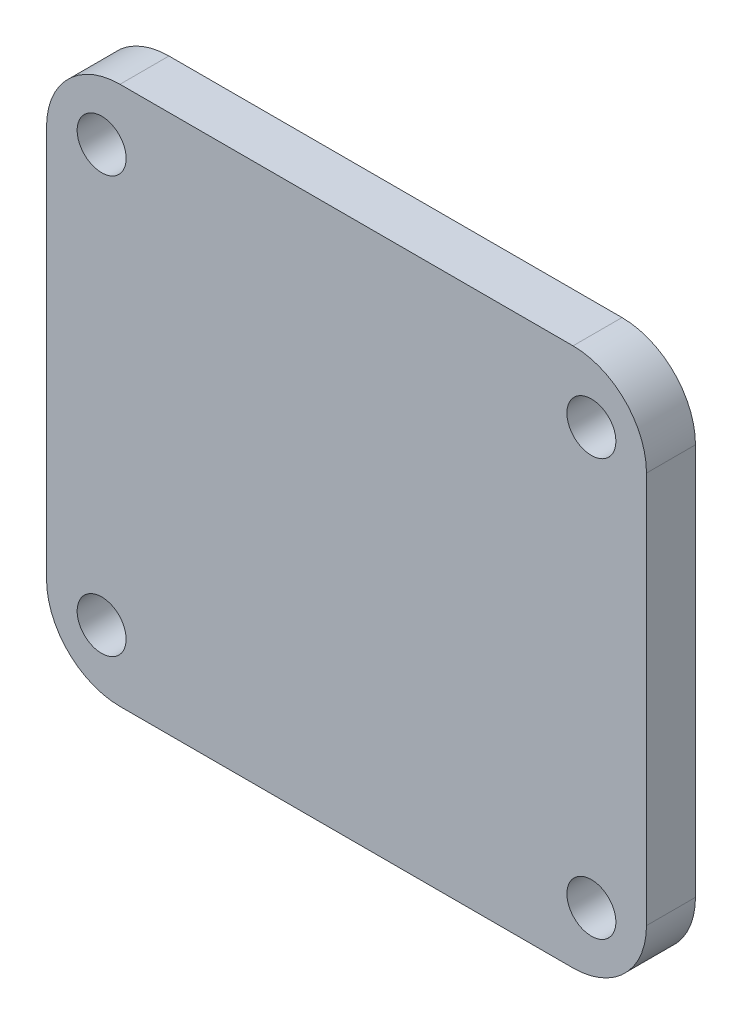
ISO-10303-21;
HEADER;
FILE_DESCRIPTION(('STEP AP214'),'2;1');
FILE_NAME('part.step','',(''),(''),'','','');
FILE_SCHEMA(('AUTOMOTIVE_DESIGN { 1 0 10303 214 1 1 1 1 }'));
ENDSEC;
DATA;
#1=APPLICATION_CONTEXT('core data for automotive mechanical design processes');
#2=APPLICATION_PROTOCOL_DEFINITION('international standard','automotive_design',2000,#1);
#3=PRODUCT_CONTEXT('',#1,'mechanical');
#4=PRODUCT('Part','Part','',(#3));
#5=PRODUCT_RELATED_PRODUCT_CATEGORY('part','',(#4));
#6=PRODUCT_DEFINITION_FORMATION('','',#4);
#7=PRODUCT_DEFINITION_CONTEXT('part definition',#1,'design');
#8=PRODUCT_DEFINITION('design','',#6,#7);
#9=PRODUCT_DEFINITION_SHAPE('','',#8);
#10=(LENGTH_UNIT() NAMED_UNIT(*) SI_UNIT(.MILLI.,.METRE.));
#11=(NAMED_UNIT(*) PLANE_ANGLE_UNIT() SI_UNIT($,.RADIAN.));
#12=(NAMED_UNIT(*) SI_UNIT($,.STERADIAN.) SOLID_ANGLE_UNIT());
#13=UNCERTAINTY_MEASURE_WITH_UNIT(LENGTH_MEASURE(1.E-05),#10,'distance_accuracy_value','');
#14=(GEOMETRIC_REPRESENTATION_CONTEXT(3) GLOBAL_UNCERTAINTY_ASSIGNED_CONTEXT((#13)) GLOBAL_UNIT_ASSIGNED_CONTEXT((#10,
#11,#12)) REPRESENTATION_CONTEXT('',''));
#15=CARTESIAN_POINT('',(0.,0.,0.));
#16=DIRECTION('',(0.,0.,1.));
#17=DIRECTION('',(1.,0.,0.));
#18=AXIS2_PLACEMENT_3D('',#15,#16,#17);
#19=CARTESIAN_POINT('',(0.,0.,2.));
#20=DIRECTION('',(0.,0.,-1.));
#21=DIRECTION('',(-1.,0.,0.));
#22=AXIS2_PLACEMENT_3D('',#19,#20,#21);
#23=PLANE('',#22);
#24=DIRECTION('',(1.,0.,0.));
#25=VECTOR('',#24,1.);
#26=CARTESIAN_POINT('',(-2.25,-2.50190000000003,2.));
#27=LINE('',#26,#25);
#28=CARTESIAN_POINT('',(0.749999999999998,-2.50190000000003,2.));
#29=VERTEX_POINT('',#28);
#30=CARTESIAN_POINT('',(19.25,-2.50190000000003,2.));
#31=VERTEX_POINT('',#30);
#32=EDGE_CURVE('E138',#29,#31,#27,.T.);
#33=ORIENTED_EDGE('',*,*,#32,.T.);
#34=CARTESIAN_POINT('',(19.25,0.498099999999968,2.));
#35=DIRECTION('',(0.,0.,-1.));
#36=DIRECTION('',(-1.,0.,0.));
#37=AXIS2_PLACEMENT_3D('',#34,#35,#36);
#38=CIRCLE('',#37,3.);
#39=CARTESIAN_POINT('',(22.25,0.498099999999967,2.));
#40=VERTEX_POINT('',#39);
#41=EDGE_CURVE('E156',#31,#40,#38,.F.);
#42=ORIENTED_EDGE('',*,*,#41,.T.);
#43=DIRECTION('',(0.,1.,0.));
#44=VECTOR('',#43,1.);
#45=CARTESIAN_POINT('',(22.25,-2.50190000000003,2.));
#46=LINE('',#45,#44);
#47=CARTESIAN_POINT('',(22.25,16.5019,2.));
#48=VERTEX_POINT('',#47);
#49=EDGE_CURVE('E120',#40,#48,#46,.T.);
#50=ORIENTED_EDGE('',*,*,#49,.T.);
#51=CARTESIAN_POINT('',(19.25,16.5019,2.));
#52=DIRECTION('',(0.,0.,-1.));
#53=DIRECTION('',(-1.,0.,0.));
#54=AXIS2_PLACEMENT_3D('',#51,#52,#53);
#55=CIRCLE('',#54,3.);
#56=CARTESIAN_POINT('',(19.25,19.5019,2.));
#57=VERTEX_POINT('',#56);
#58=EDGE_CURVE('E152',#48,#57,#55,.F.);
#59=ORIENTED_EDGE('',*,*,#58,.T.);
#60=DIRECTION('',(-1.,0.,0.));
#61=VECTOR('',#60,1.);
#62=CARTESIAN_POINT('',(-2.25,19.5019,2.));
#63=LINE('',#62,#61);
#64=CARTESIAN_POINT('',(0.749999999999998,19.5019,2.));
#65=VERTEX_POINT('',#64);
#66=EDGE_CURVE('E165',#57,#65,#63,.T.);
#67=ORIENTED_EDGE('',*,*,#66,.T.);
#68=CARTESIAN_POINT('',(0.749999999999998,16.5019,2.));
#69=DIRECTION('',(0.,0.,-1.));
#70=DIRECTION('',(-1.,0.,0.));
#71=AXIS2_PLACEMENT_3D('',#68,#69,#70);
#72=CIRCLE('',#71,3.);
#73=CARTESIAN_POINT('',(-2.25,16.5019,2.));
#74=VERTEX_POINT('',#73);
#75=EDGE_CURVE('E55',#65,#74,#72,.F.);
#76=ORIENTED_EDGE('',*,*,#75,.T.);
#77=DIRECTION('',(0.,-1.,0.));
#78=VECTOR('',#77,1.);
#79=CARTESIAN_POINT('',(-2.25,-2.50190000000003,2.));
#80=LINE('',#79,#78);
#81=CARTESIAN_POINT('',(-2.25,0.498099999999967,2.));
#82=VERTEX_POINT('',#81);
#83=EDGE_CURVE('E171',#74,#82,#80,.T.);
#84=ORIENTED_EDGE('',*,*,#83,.T.);
#85=CARTESIAN_POINT('',(0.749999999999998,0.498099999999968,2.));
#86=DIRECTION('',(0.,0.,-1.));
#87=DIRECTION('',(-1.,0.,0.));
#88=AXIS2_PLACEMENT_3D('',#85,#86,#87);
#89=CIRCLE('',#88,3.);
#90=EDGE_CURVE('E154',#82,#29,#89,.F.);
#91=ORIENTED_EDGE('',*,*,#90,.T.);
#92=EDGE_LOOP('',(#33,#42,#50,#59,#67,#76,#84,#91));
#93=FACE_BOUND('',#92,.T.);
#94=CARTESIAN_POINT('',(0.,0.,2.));
#95=DIRECTION('',(0.,0.,1.));
#96=DIRECTION('',(1.,0.,0.));
#97=AXIS2_PLACEMENT_3D('',#94,#95,#96);
#98=CIRCLE('',#97,1.);
#99=CARTESIAN_POINT('',(1.,0.,2.));
#100=VERTEX_POINT('',#99);
#101=EDGE_CURVE('E129',#100,#100,#98,.T.);
#102=ORIENTED_EDGE('',*,*,#101,.F.);
#103=EDGE_LOOP('',(#102));
#104=FACE_BOUND('',#103,.T.);
#105=CARTESIAN_POINT('',(20.,0.,2.));
#106=DIRECTION('',(0.,0.,1.));
#107=DIRECTION('',(1.,0.,0.));
#108=AXIS2_PLACEMENT_3D('',#105,#106,#107);
#109=CIRCLE('',#108,1.);
#110=CARTESIAN_POINT('',(21.,0.,2.));
#111=VERTEX_POINT('',#110);
#112=EDGE_CURVE('E186',#111,#111,#109,.T.);
#113=ORIENTED_EDGE('',*,*,#112,.F.);
#114=EDGE_LOOP('',(#113));
#115=FACE_BOUND('',#114,.T.);
#116=CARTESIAN_POINT('',(20.,17.,2.));
#117=DIRECTION('',(0.,0.,1.));
#118=DIRECTION('',(1.,0.,0.));
#119=AXIS2_PLACEMENT_3D('',#116,#117,#118);
#120=CIRCLE('',#119,1.);
#121=CARTESIAN_POINT('',(21.,17.,2.));
#122=VERTEX_POINT('',#121);
#123=EDGE_CURVE('E191',#122,#122,#120,.T.);
#124=ORIENTED_EDGE('',*,*,#123,.F.);
#125=EDGE_LOOP('',(#124));
#126=FACE_BOUND('',#125,.T.);
#127=CARTESIAN_POINT('',(0.,17.,2.));
#128=DIRECTION('',(0.,0.,1.));
#129=DIRECTION('',(1.,0.,0.));
#130=AXIS2_PLACEMENT_3D('',#127,#128,#129);
#131=CIRCLE('',#130,1.);
#132=CARTESIAN_POINT('',(1.,17.,2.));
#133=VERTEX_POINT('',#132);
#134=EDGE_CURVE('E197',#133,#133,#131,.T.);
#135=ORIENTED_EDGE('',*,*,#134,.F.);
#136=EDGE_LOOP('',(#135));
#137=FACE_BOUND('',#136,.T.);
#138=ADVANCED_FACE('F33',(#93,#104,#115,#126,#137),#23,.F.);
#139=CARTESIAN_POINT('',(0.,0.,0.));
#140=DIRECTION('',(0.,0.,-1.));
#141=DIRECTION('',(-1.,0.,0.));
#142=AXIS2_PLACEMENT_3D('',#139,#140,#141);
#143=PLANE('',#142);
#144=CARTESIAN_POINT('',(20.,17.,0.));
#145=DIRECTION('',(0.,0.,1.));
#146=DIRECTION('',(1.,0.,0.));
#147=AXIS2_PLACEMENT_3D('',#144,#145,#146);
#148=CIRCLE('',#147,1.);
#149=CARTESIAN_POINT('',(21.,17.,0.));
#150=VERTEX_POINT('',#149);
#151=EDGE_CURVE('E194',#150,#150,#148,.T.);
#152=ORIENTED_EDGE('',*,*,#151,.T.);
#153=EDGE_LOOP('',(#152));
#154=FACE_BOUND('',#153,.T.);
#155=CARTESIAN_POINT('',(0.,0.,0.));
#156=DIRECTION('',(0.,0.,1.));
#157=DIRECTION('',(1.,0.,0.));
#158=AXIS2_PLACEMENT_3D('',#155,#156,#157);
#159=CIRCLE('',#158,1.);
#160=CARTESIAN_POINT('',(1.,0.,0.));
#161=VERTEX_POINT('',#160);
#162=EDGE_CURVE('E135',#161,#161,#159,.T.);
#163=ORIENTED_EDGE('',*,*,#162,.T.);
#164=EDGE_LOOP('',(#163));
#165=FACE_BOUND('',#164,.T.);
#166=DIRECTION('',(0.,1.,0.));
#167=VECTOR('',#166,1.);
#168=CARTESIAN_POINT('',(22.25,-2.50190000000003,0.));
#169=LINE('',#168,#167);
#170=CARTESIAN_POINT('',(22.25,0.498099999999967,0.));
#171=VERTEX_POINT('',#170);
#172=CARTESIAN_POINT('',(22.25,16.5019,0.));
#173=VERTEX_POINT('',#172);
#174=EDGE_CURVE('E117',#171,#173,#169,.T.);
#175=ORIENTED_EDGE('',*,*,#174,.F.);
#176=CARTESIAN_POINT('',(19.25,0.498099999999968,0.));
#177=DIRECTION('',(0.,0.,-1.));
#178=DIRECTION('',(-1.,0.,0.));
#179=AXIS2_PLACEMENT_3D('',#176,#177,#178);
#180=CIRCLE('',#179,3.);
#181=CARTESIAN_POINT('',(19.25,-2.50190000000003,0.));
#182=VERTEX_POINT('',#181);
#183=EDGE_CURVE('E100',#171,#182,#180,.T.);
#184=ORIENTED_EDGE('',*,*,#183,.T.);
#185=DIRECTION('',(1.,0.,0.));
#186=VECTOR('',#185,1.);
#187=CARTESIAN_POINT('',(-2.25,-2.50190000000003,0.));
#188=LINE('',#187,#186);
#189=CARTESIAN_POINT('',(0.749999999999998,-2.50190000000003,0.));
#190=VERTEX_POINT('',#189);
#191=EDGE_CURVE('E142',#190,#182,#188,.T.);
#192=ORIENTED_EDGE('',*,*,#191,.F.);
#193=CARTESIAN_POINT('',(0.749999999999998,0.498099999999968,0.));
#194=DIRECTION('',(0.,0.,-1.));
#195=DIRECTION('',(-1.,0.,0.));
#196=AXIS2_PLACEMENT_3D('',#193,#194,#195);
#197=CIRCLE('',#196,3.);
#198=CARTESIAN_POINT('',(-2.25,0.498099999999967,0.));
#199=VERTEX_POINT('',#198);
#200=EDGE_CURVE('E111',#190,#199,#197,.T.);
#201=ORIENTED_EDGE('',*,*,#200,.T.);
#202=DIRECTION('',(0.,-1.,0.));
#203=VECTOR('',#202,1.);
#204=CARTESIAN_POINT('',(-2.25,-2.50190000000003,0.));
#205=LINE('',#204,#203);
#206=CARTESIAN_POINT('',(-2.25,16.5019,0.));
#207=VERTEX_POINT('',#206);
#208=EDGE_CURVE('E132',#207,#199,#205,.T.);
#209=ORIENTED_EDGE('',*,*,#208,.F.);
#210=CARTESIAN_POINT('',(0.749999999999998,16.5019,0.));
#211=DIRECTION('',(0.,0.,-1.));
#212=DIRECTION('',(-1.,0.,0.));
#213=AXIS2_PLACEMENT_3D('',#210,#211,#212);
#214=CIRCLE('',#213,3.);
#215=CARTESIAN_POINT('',(0.749999999999998,19.5019,0.));
#216=VERTEX_POINT('',#215);
#217=EDGE_CURVE('E121',#207,#216,#214,.T.);
#218=ORIENTED_EDGE('',*,*,#217,.T.);
#219=DIRECTION('',(-1.,0.,0.));
#220=VECTOR('',#219,1.);
#221=CARTESIAN_POINT('',(-2.25,19.5019,0.));
#222=LINE('',#221,#220);
#223=CARTESIAN_POINT('',(19.25,19.5019,0.));
#224=VERTEX_POINT('',#223);
#225=EDGE_CURVE('E128',#224,#216,#222,.T.);
#226=ORIENTED_EDGE('',*,*,#225,.F.);
#227=CARTESIAN_POINT('',(19.25,16.5019,0.));
#228=DIRECTION('',(0.,0.,-1.));
#229=DIRECTION('',(-1.,0.,0.));
#230=AXIS2_PLACEMENT_3D('',#227,#228,#229);
#231=CIRCLE('',#230,3.);
#232=EDGE_CURVE('E127',#224,#173,#231,.T.);
#233=ORIENTED_EDGE('',*,*,#232,.T.);
#234=EDGE_LOOP('',(#175,#184,#192,#201,#209,#218,#226,#233));
#235=FACE_BOUND('',#234,.T.);
#236=CARTESIAN_POINT('',(20.,0.,0.));
#237=DIRECTION('',(0.,0.,1.));
#238=DIRECTION('',(1.,0.,0.));
#239=AXIS2_PLACEMENT_3D('',#236,#237,#238);
#240=CIRCLE('',#239,1.);
#241=CARTESIAN_POINT('',(21.,0.,0.));
#242=VERTEX_POINT('',#241);
#243=EDGE_CURVE('E188',#242,#242,#240,.T.);
#244=ORIENTED_EDGE('',*,*,#243,.T.);
#245=EDGE_LOOP('',(#244));
#246=FACE_BOUND('',#245,.T.);
#247=CARTESIAN_POINT('',(0.,17.,0.));
#248=DIRECTION('',(0.,0.,1.));
#249=DIRECTION('',(1.,0.,0.));
#250=AXIS2_PLACEMENT_3D('',#247,#248,#249);
#251=CIRCLE('',#250,1.);
#252=CARTESIAN_POINT('',(1.,17.,0.));
#253=VERTEX_POINT('',#252);
#254=EDGE_CURVE('E200',#253,#253,#251,.T.);
#255=ORIENTED_EDGE('',*,*,#254,.T.);
#256=EDGE_LOOP('',(#255));
#257=FACE_BOUND('',#256,.T.);
#258=ADVANCED_FACE('F124',(#154,#165,#235,#246,#257),#143,.T.);
#259=CARTESIAN_POINT('',(22.25,-2.50190000000003,2.));
#260=DIRECTION('',(-1.,0.,0.));
#261=DIRECTION('',(0.,0.,1.));
#262=AXIS2_PLACEMENT_3D('',#259,#260,#261);
#263=PLANE('',#262);
#264=ORIENTED_EDGE('',*,*,#49,.F.);
#265=DIRECTION('',(0.,0.,-1.));
#266=VECTOR('',#265,1.);
#267=CARTESIAN_POINT('',(22.25,0.498099999999968,2.));
#268=LINE('',#267,#266);
#269=EDGE_CURVE('E104',#40,#171,#268,.T.);
#270=ORIENTED_EDGE('',*,*,#269,.T.);
#271=ORIENTED_EDGE('',*,*,#174,.T.);
#272=DIRECTION('',(0.,0.,-1.));
#273=VECTOR('',#272,1.);
#274=CARTESIAN_POINT('',(22.25,16.5019,2.));
#275=LINE('',#274,#273);
#276=EDGE_CURVE('E122',#173,#48,#275,.F.);
#277=ORIENTED_EDGE('',*,*,#276,.T.);
#278=EDGE_LOOP('',(#264,#270,#271,#277));
#279=FACE_BOUND('',#278,.T.);
#280=ADVANCED_FACE('F116',(#279),#263,.F.);
#281=CARTESIAN_POINT('',(-2.25,19.5019,2.));
#282=DIRECTION('',(0.,-1.,0.));
#283=DIRECTION('',(0.,0.,-1.));
#284=AXIS2_PLACEMENT_3D('',#281,#282,#283);
#285=PLANE('',#284);
#286=ORIENTED_EDGE('',*,*,#66,.F.);
#287=DIRECTION('',(0.,0.,-1.));
#288=VECTOR('',#287,1.);
#289=CARTESIAN_POINT('',(19.25,19.5019,2.));
#290=LINE('',#289,#288);
#291=EDGE_CURVE('E11',#57,#224,#290,.T.);
#292=ORIENTED_EDGE('',*,*,#291,.T.);
#293=ORIENTED_EDGE('',*,*,#225,.T.);
#294=DIRECTION('',(0.,0.,-1.));
#295=VECTOR('',#294,1.);
#296=CARTESIAN_POINT('',(0.749999999999998,19.5019,2.));
#297=LINE('',#296,#295);
#298=EDGE_CURVE('E41',#216,#65,#297,.F.);
#299=ORIENTED_EDGE('',*,*,#298,.T.);
#300=EDGE_LOOP('',(#286,#292,#293,#299));
#301=FACE_BOUND('',#300,.T.);
#302=ADVANCED_FACE('F164',(#301),#285,.F.);
#303=CARTESIAN_POINT('',(-2.25,-2.50190000000003,2.));
#304=DIRECTION('',(1.,0.,0.));
#305=DIRECTION('',(0.,0.,-1.));
#306=AXIS2_PLACEMENT_3D('',#303,#304,#305);
#307=PLANE('',#306);
#308=ORIENTED_EDGE('',*,*,#208,.T.);
#309=DIRECTION('',(0.,0.,-1.));
#310=VECTOR('',#309,1.);
#311=CARTESIAN_POINT('',(-2.25,0.498099999999968,2.));
#312=LINE('',#311,#310);
#313=EDGE_CURVE('E48',#199,#82,#312,.F.);
#314=ORIENTED_EDGE('',*,*,#313,.T.);
#315=ORIENTED_EDGE('',*,*,#83,.F.);
#316=DIRECTION('',(0.,0.,-1.));
#317=VECTOR('',#316,1.);
#318=CARTESIAN_POINT('',(-2.25,16.5019,2.));
#319=LINE('',#318,#317);
#320=EDGE_CURVE('E158',#74,#207,#319,.T.);
#321=ORIENTED_EDGE('',*,*,#320,.T.);
#322=EDGE_LOOP('',(#308,#314,#315,#321));
#323=FACE_BOUND('',#322,.T.);
#324=ADVANCED_FACE('F175',(#323),#307,.F.);
#325=CARTESIAN_POINT('',(-2.25,-2.50190000000003,2.));
#326=DIRECTION('',(0.,1.,0.));
#327=DIRECTION('',(0.,0.,1.));
#328=AXIS2_PLACEMENT_3D('',#325,#326,#327);
#329=PLANE('',#328);
#330=ORIENTED_EDGE('',*,*,#191,.T.);
#331=DIRECTION('',(0.,0.,-1.));
#332=VECTOR('',#331,1.);
#333=CARTESIAN_POINT('',(19.25,-2.50190000000003,2.));
#334=LINE('',#333,#332);
#335=EDGE_CURVE('E105',#182,#31,#334,.F.);
#336=ORIENTED_EDGE('',*,*,#335,.T.);
#337=ORIENTED_EDGE('',*,*,#32,.F.);
#338=DIRECTION('',(0.,0.,-1.));
#339=VECTOR('',#338,1.);
#340=CARTESIAN_POINT('',(0.749999999999998,-2.50190000000003,2.));
#341=LINE('',#340,#339);
#342=EDGE_CURVE('E110',#29,#190,#341,.T.);
#343=ORIENTED_EDGE('',*,*,#342,.T.);
#344=EDGE_LOOP('',(#330,#336,#337,#343));
#345=FACE_BOUND('',#344,.T.);
#346=ADVANCED_FACE('F182',(#345),#329,.F.);
#347=CARTESIAN_POINT('',(0.,0.,2.));
#348=DIRECTION('',(0.,0.,-1.));
#349=DIRECTION('',(-1.,0.,0.));
#350=AXIS2_PLACEMENT_3D('',#347,#348,#349);
#351=CYLINDRICAL_SURFACE('',#350,1.);
#352=ORIENTED_EDGE('',*,*,#101,.T.);
#353=EDGE_LOOP('',(#352));
#354=FACE_BOUND('',#353,.T.);
#355=ORIENTED_EDGE('',*,*,#162,.F.);
#356=EDGE_LOOP('',(#355));
#357=FACE_BOUND('',#356,.T.);
#358=ADVANCED_FACE('F217',(#354,#357),#351,.F.);
#359=CARTESIAN_POINT('',(20.,0.,2.));
#360=DIRECTION('',(0.,0.,-1.));
#361=DIRECTION('',(-1.,0.,0.));
#362=AXIS2_PLACEMENT_3D('',#359,#360,#361);
#363=CYLINDRICAL_SURFACE('',#362,1.);
#364=ORIENTED_EDGE('',*,*,#112,.T.);
#365=EDGE_LOOP('',(#364));
#366=FACE_BOUND('',#365,.T.);
#367=ORIENTED_EDGE('',*,*,#243,.F.);
#368=EDGE_LOOP('',(#367));
#369=FACE_BOUND('',#368,.T.);
#370=ADVANCED_FACE('F309',(#366,#369),#363,.F.);
#371=CARTESIAN_POINT('',(20.,17.,2.));
#372=DIRECTION('',(0.,0.,-1.));
#373=DIRECTION('',(-1.,0.,0.));
#374=AXIS2_PLACEMENT_3D('',#371,#372,#373);
#375=CYLINDRICAL_SURFACE('',#374,1.);
#376=ORIENTED_EDGE('',*,*,#123,.T.);
#377=EDGE_LOOP('',(#376));
#378=FACE_BOUND('',#377,.T.);
#379=ORIENTED_EDGE('',*,*,#151,.F.);
#380=EDGE_LOOP('',(#379));
#381=FACE_BOUND('',#380,.T.);
#382=ADVANCED_FACE('F300',(#378,#381),#375,.F.);
#383=CARTESIAN_POINT('',(0.,17.,2.));
#384=DIRECTION('',(0.,0.,-1.));
#385=DIRECTION('',(-1.,0.,0.));
#386=AXIS2_PLACEMENT_3D('',#383,#384,#385);
#387=CYLINDRICAL_SURFACE('',#386,1.);
#388=ORIENTED_EDGE('',*,*,#134,.T.);
#389=EDGE_LOOP('',(#388));
#390=FACE_BOUND('',#389,.T.);
#391=ORIENTED_EDGE('',*,*,#254,.F.);
#392=EDGE_LOOP('',(#391));
#393=FACE_BOUND('',#392,.T.);
#394=ADVANCED_FACE('F206',(#390,#393),#387,.F.);
#395=CARTESIAN_POINT('',(19.25,0.498099999999968,2.));
#396=DIRECTION('',(0.,0.,-1.));
#397=DIRECTION('',(-1.,0.,0.));
#398=AXIS2_PLACEMENT_3D('',#395,#396,#397);
#399=CYLINDRICAL_SURFACE('',#398,3.);
#400=ORIENTED_EDGE('',*,*,#41,.F.);
#401=ORIENTED_EDGE('',*,*,#335,.F.);
#402=ORIENTED_EDGE('',*,*,#183,.F.);
#403=ORIENTED_EDGE('',*,*,#269,.F.);
#404=EDGE_LOOP('',(#400,#401,#402,#403));
#405=FACE_BOUND('',#404,.T.);
#406=ADVANCED_FACE('F103',(#405),#399,.T.);
#407=CARTESIAN_POINT('',(0.749999999999998,0.498099999999968,2.));
#408=DIRECTION('',(0.,0.,-1.));
#409=DIRECTION('',(-1.,0.,0.));
#410=AXIS2_PLACEMENT_3D('',#407,#408,#409);
#411=CYLINDRICAL_SURFACE('',#410,3.);
#412=ORIENTED_EDGE('',*,*,#90,.F.);
#413=ORIENTED_EDGE('',*,*,#313,.F.);
#414=ORIENTED_EDGE('',*,*,#200,.F.);
#415=ORIENTED_EDGE('',*,*,#342,.F.);
#416=EDGE_LOOP('',(#412,#413,#414,#415));
#417=FACE_BOUND('',#416,.T.);
#418=ADVANCED_FACE('F179',(#417),#411,.T.);
#419=CARTESIAN_POINT('',(19.25,16.5019,2.));
#420=DIRECTION('',(0.,0.,-1.));
#421=DIRECTION('',(-1.,0.,0.));
#422=AXIS2_PLACEMENT_3D('',#419,#420,#421);
#423=CYLINDRICAL_SURFACE('',#422,3.);
#424=ORIENTED_EDGE('',*,*,#58,.F.);
#425=ORIENTED_EDGE('',*,*,#276,.F.);
#426=ORIENTED_EDGE('',*,*,#232,.F.);
#427=ORIENTED_EDGE('',*,*,#291,.F.);
#428=EDGE_LOOP('',(#424,#425,#426,#427));
#429=FACE_BOUND('',#428,.T.);
#430=ADVANCED_FACE('F231',(#429),#423,.T.);
#431=CARTESIAN_POINT('',(0.749999999999998,16.5019,2.));
#432=DIRECTION('',(0.,0.,-1.));
#433=DIRECTION('',(-1.,0.,0.));
#434=AXIS2_PLACEMENT_3D('',#431,#432,#433);
#435=CYLINDRICAL_SURFACE('',#434,3.);
#436=ORIENTED_EDGE('',*,*,#75,.F.);
#437=ORIENTED_EDGE('',*,*,#298,.F.);
#438=ORIENTED_EDGE('',*,*,#217,.F.);
#439=ORIENTED_EDGE('',*,*,#320,.F.);
#440=EDGE_LOOP('',(#436,#437,#438,#439));
#441=FACE_BOUND('',#440,.T.);
#442=ADVANCED_FACE('F35',(#441),#435,.T.);
#443=CLOSED_SHELL('',(#138,#258,#280,#302,#324,#346,#358,#370,#382,#394,#406,#418,#430,#442));
#444=MANIFOLD_SOLID_BREP('B2',#443);
#445=ADVANCED_BREP_SHAPE_REPRESENTATION('',(#18,#444),#14);
#446=SHAPE_DEFINITION_REPRESENTATION(#9,#445);
ENDSEC;
END-ISO-10303-21;
